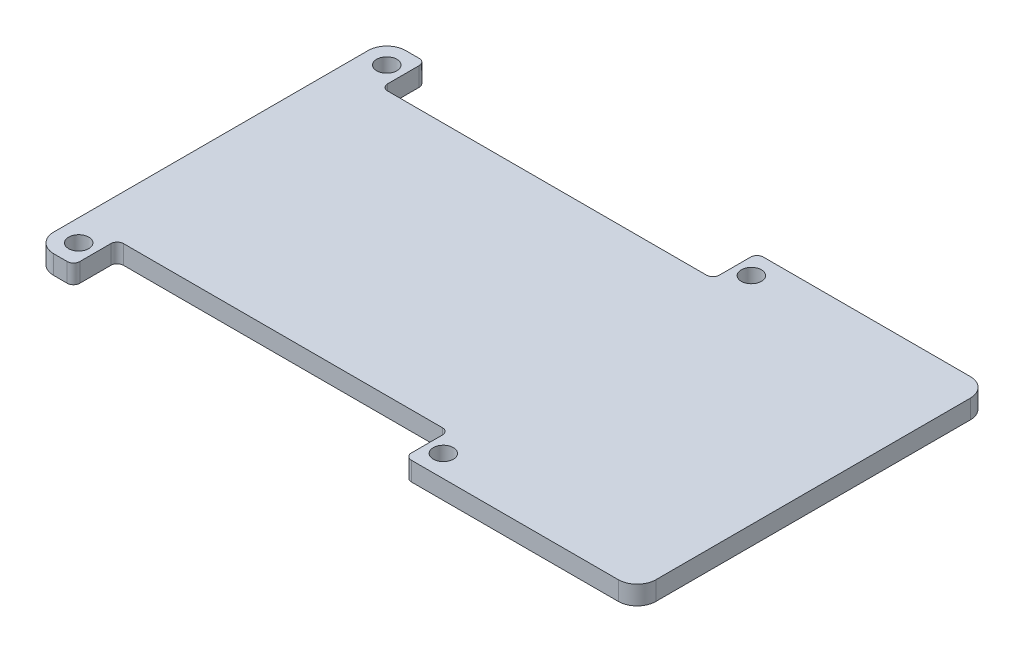
ISO-10303-21;
HEADER;
FILE_DESCRIPTION(('STEP AP214'),'2;1');
FILE_NAME('part.step','',(''),(''),'','','');
FILE_SCHEMA(('AUTOMOTIVE_DESIGN { 1 0 10303 214 1 1 1 1 }'));
ENDSEC;
DATA;
#1=APPLICATION_CONTEXT('core data for automotive mechanical design processes');
#2=APPLICATION_PROTOCOL_DEFINITION('international standard','automotive_design',2000,#1);
#3=PRODUCT_CONTEXT('',#1,'mechanical');
#4=PRODUCT('Part','Part','',(#3));
#5=PRODUCT_RELATED_PRODUCT_CATEGORY('part','',(#4));
#6=PRODUCT_DEFINITION_FORMATION('','',#4);
#7=PRODUCT_DEFINITION_CONTEXT('part definition',#1,'design');
#8=PRODUCT_DEFINITION('design','',#6,#7);
#9=PRODUCT_DEFINITION_SHAPE('','',#8);
#10=(LENGTH_UNIT() NAMED_UNIT(*) SI_UNIT(.MILLI.,.METRE.));
#11=(NAMED_UNIT(*) PLANE_ANGLE_UNIT() SI_UNIT($,.RADIAN.));
#12=(NAMED_UNIT(*) SI_UNIT($,.STERADIAN.) SOLID_ANGLE_UNIT());
#13=UNCERTAINTY_MEASURE_WITH_UNIT(LENGTH_MEASURE(1.E-05),#10,'distance_accuracy_value','');
#14=(GEOMETRIC_REPRESENTATION_CONTEXT(3) GLOBAL_UNCERTAINTY_ASSIGNED_CONTEXT((#13)) GLOBAL_UNIT_ASSIGNED_CONTEXT((#10,
#11,#12)) REPRESENTATION_CONTEXT('',''));
#15=CARTESIAN_POINT('',(0.,0.,0.));
#16=DIRECTION('',(0.,0.,1.));
#17=DIRECTION('',(1.,0.,0.));
#18=AXIS2_PLACEMENT_3D('',#15,#16,#17);
#19=CARTESIAN_POINT('',(-77.0217231267692,3.,-21.4026703774337));
#20=DIRECTION('',(0.,1.,0.));
#21=DIRECTION('',(0.,0.,1.));
#22=AXIS2_PLACEMENT_3D('',#19,#20,#21);
#23=PLANE('',#22);
#24=CARTESIAN_POINT('',(-18.5283322199872,3.,28.1136567752183));
#25=DIRECTION('',(0.,1.,0.));
#26=DIRECTION('',(0.,0.,1.));
#27=AXIS2_PLACEMENT_3D('',#24,#25,#26);
#28=CIRCLE('',#27,1.6);
#29=CARTESIAN_POINT('',(-18.5283322199872,3.,29.7136567752183));
#30=VERTEX_POINT('',#29);
#31=EDGE_CURVE('E453',#30,#30,#28,.T.);
#32=ORIENTED_EDGE('',*,*,#31,.F.);
#33=EDGE_LOOP('',(#32));
#34=FACE_BOUND('',#33,.T.);
#35=CARTESIAN_POINT('',(-76.5284846202892,3.,-20.8867242255417));
#36=DIRECTION('',(0.,1.,0.));
#37=DIRECTION('',(0.,0.,1.));
#38=AXIS2_PLACEMENT_3D('',#35,#36,#37);
#39=CIRCLE('',#38,1.6);
#40=CARTESIAN_POINT('',(-76.5284846202892,3.,-19.2867242255417));
#41=VERTEX_POINT('',#40);
#42=EDGE_CURVE('E236',#41,#41,#39,.T.);
#43=ORIENTED_EDGE('',*,*,#42,.F.);
#44=EDGE_LOOP('',(#43));
#45=FACE_BOUND('',#44,.T.);
#46=CARTESIAN_POINT('',(-77.0217231267692,3.,-21.4026703774337));
#47=DIRECTION('',(0.,1.,0.));
#48=DIRECTION('',(0.,0.,1.));
#49=AXIS2_PLACEMENT_3D('',#46,#47,#48);
#50=CIRCLE('',#49,2.98730505461);
#51=CARTESIAN_POINT('',(-77.0217231267692,3.,-24.3899754320437));
#52=VERTEX_POINT('',#51);
#53=CARTESIAN_POINT('',(-80.0090281813792,3.,-21.4026703774337));
#54=VERTEX_POINT('',#53);
#55=EDGE_CURVE('E279',#52,#54,#50,.T.);
#56=ORIENTED_EDGE('',*,*,#55,.T.);
#57=DIRECTION('',(0.,0.,1.));
#58=VECTOR('',#57,1.);
#59=CARTESIAN_POINT('',(-80.0090281813792,3.,-21.4026703774337));
#60=LINE('',#59,#58);
#61=CARTESIAN_POINT('',(-80.0090281813792,3.,28.6044314767683));
#62=VERTEX_POINT('',#61);
#63=EDGE_CURVE('E147',#54,#62,#60,.T.);
#64=ORIENTED_EDGE('',*,*,#63,.T.);
#65=CARTESIAN_POINT('',(-77.0217231267692,3.,28.6044314767683));
#66=DIRECTION('',(0.,1.,0.));
#67=DIRECTION('',(0.,0.,1.));
#68=AXIS2_PLACEMENT_3D('',#65,#66,#67);
#69=CIRCLE('',#68,2.98730505460999);
#70=CARTESIAN_POINT('',(-77.0217231267692,3.,31.5917365313783));
#71=VERTEX_POINT('',#70);
#72=EDGE_CURVE('E342',#62,#71,#69,.T.);
#73=ORIENTED_EDGE('',*,*,#72,.T.);
#74=DIRECTION('',(1.,0.,0.));
#75=VECTOR('',#74,1.);
#76=CARTESIAN_POINT('',(-77.0217231267692,3.,31.5917365313783));
#77=LINE('',#76,#75);
#78=CARTESIAN_POINT('',(-74.8747309147499,3.,31.5917365313783));
#79=VERTEX_POINT('',#78);
#80=EDGE_CURVE('E361',#71,#79,#77,.T.);
#81=ORIENTED_EDGE('',*,*,#80,.T.);
#82=CARTESIAN_POINT('',(-74.8747309147499,3.,30.5917365313783));
#83=DIRECTION('',(0.,1.,0.));
#84=DIRECTION('',(0.,0.,1.));
#85=AXIS2_PLACEMENT_3D('',#82,#83,#84);
#86=CIRCLE('',#85,1.);
#87=CARTESIAN_POINT('',(-73.8747309147499,3.,30.5917365313783));
#88=VERTEX_POINT('',#87);
#89=EDGE_CURVE('E358',#79,#88,#86,.T.);
#90=ORIENTED_EDGE('',*,*,#89,.T.);
#91=DIRECTION('',(0.,0.,-1.));
#92=VECTOR('',#91,1.);
#93=CARTESIAN_POINT('',(-73.8747309147499,3.,30.5917365313783));
#94=LINE('',#93,#92);
#95=CARTESIAN_POINT('',(-73.8747309147499,3.,25.6450286497662));
#96=VERTEX_POINT('',#95);
#97=EDGE_CURVE('E360',#88,#96,#94,.T.);
#98=ORIENTED_EDGE('',*,*,#97,.T.);
#99=CARTESIAN_POINT('',(-72.8747309147499,3.,25.6450286497662));
#100=DIRECTION('',(0.,-1.,0.));
#101=DIRECTION('',(0.,0.,-1.));
#102=AXIS2_PLACEMENT_3D('',#99,#100,#101);
#103=CIRCLE('',#102,1.);
#104=CARTESIAN_POINT('',(-72.8747309147499,3.,24.6450286497662));
#105=VERTEX_POINT('',#104);
#106=EDGE_CURVE('E363',#96,#105,#103,.T.);
#107=ORIENTED_EDGE('',*,*,#106,.T.);
#108=DIRECTION('',(1.,0.,0.));
#109=VECTOR('',#108,1.);
#110=CARTESIAN_POINT('',(-72.8747309147499,3.,24.6450286497662));
#111=LINE('',#110,#109);
#112=CARTESIAN_POINT('',(-22.1346281962434,3.,24.6450286497662));
#113=VERTEX_POINT('',#112);
#114=EDGE_CURVE('E369',#105,#113,#111,.T.);
#115=ORIENTED_EDGE('',*,*,#114,.T.);
#116=CARTESIAN_POINT('',(-22.1346281962434,3.,25.6450286497662));
#117=DIRECTION('',(0.,-1.,0.));
#118=DIRECTION('',(0.,0.,-1.));
#119=AXIS2_PLACEMENT_3D('',#116,#117,#118);
#120=CIRCLE('',#119,1.);
#121=CARTESIAN_POINT('',(-21.1346281962434,3.,25.6450286497662));
#122=VERTEX_POINT('',#121);
#123=EDGE_CURVE('E371',#113,#122,#120,.T.);
#124=ORIENTED_EDGE('',*,*,#123,.T.);
#125=DIRECTION('',(0.,0.,1.));
#126=VECTOR('',#125,1.);
#127=CARTESIAN_POINT('',(-21.1346281962434,3.,25.6450286497662));
#128=LINE('',#127,#126);
#129=CARTESIAN_POINT('',(-21.1346281962434,3.,30.5917365313783));
#130=VERTEX_POINT('',#129);
#131=EDGE_CURVE('E373',#122,#130,#128,.T.);
#132=ORIENTED_EDGE('',*,*,#131,.T.);
#133=CARTESIAN_POINT('',(-20.1346281962434,3.,30.5917365313783));
#134=DIRECTION('',(0.,1.,0.));
#135=DIRECTION('',(0.,0.,1.));
#136=AXIS2_PLACEMENT_3D('',#133,#134,#135);
#137=CIRCLE('',#136,1.);
#138=CARTESIAN_POINT('',(-20.1346281962434,3.,31.5917365313783));
#139=VERTEX_POINT('',#138);
#140=EDGE_CURVE('E375',#130,#139,#137,.T.);
#141=ORIENTED_EDGE('',*,*,#140,.T.);
#142=DIRECTION('',(1.,0.,0.));
#143=VECTOR('',#142,1.);
#144=CARTESIAN_POINT('',(-20.1346281962434,3.,31.5917365313783));
#145=LINE('',#144,#143);
#146=CARTESIAN_POINT('',(12.7872583311938,3.,31.5917365313783));
#147=VERTEX_POINT('',#146);
#148=EDGE_CURVE('E377',#139,#147,#145,.T.);
#149=ORIENTED_EDGE('',*,*,#148,.T.);
#150=CARTESIAN_POINT('',(12.7872583311938,3.,28.6044314767683));
#151=DIRECTION('',(0.,1.,0.));
#152=DIRECTION('',(0.,0.,1.));
#153=AXIS2_PLACEMENT_3D('',#150,#151,#152);
#154=CIRCLE('',#153,2.98730505461);
#155=CARTESIAN_POINT('',(15.7745633858038,3.,28.6044314767683));
#156=VERTEX_POINT('',#155);
#157=EDGE_CURVE('E379',#147,#156,#154,.T.);
#158=ORIENTED_EDGE('',*,*,#157,.T.);
#159=DIRECTION('',(0.,0.,-1.));
#160=VECTOR('',#159,1.);
#161=CARTESIAN_POINT('',(15.7745633858038,3.,28.6044314767683));
#162=LINE('',#161,#160);
#163=CARTESIAN_POINT('',(15.7745633858038,3.,-21.4026703774337));
#164=VERTEX_POINT('',#163);
#165=EDGE_CURVE('E381',#156,#164,#162,.T.);
#166=ORIENTED_EDGE('',*,*,#165,.T.);
#167=CARTESIAN_POINT('',(12.7872583311938,3.,-21.4026703774337));
#168=DIRECTION('',(0.,1.,0.));
#169=DIRECTION('',(0.,0.,1.));
#170=AXIS2_PLACEMENT_3D('',#167,#168,#169);
#171=CIRCLE('',#170,2.98730505461001);
#172=CARTESIAN_POINT('',(12.7872583311938,3.,-24.3899754320437));
#173=VERTEX_POINT('',#172);
#174=EDGE_CURVE('E383',#164,#173,#171,.T.);
#175=ORIENTED_EDGE('',*,*,#174,.T.);
#176=DIRECTION('',(-1.,0.,0.));
#177=VECTOR('',#176,1.);
#178=CARTESIAN_POINT('',(12.7872583311938,3.,-24.3899754320437));
#179=LINE('',#178,#177);
#180=CARTESIAN_POINT('',(-20.1346281962434,3.,-24.3899754320437));
#181=VERTEX_POINT('',#180);
#182=EDGE_CURVE('E385',#173,#181,#179,.T.);
#183=ORIENTED_EDGE('',*,*,#182,.T.);
#184=CARTESIAN_POINT('',(-20.1346281962434,3.,-23.3899754320437));
#185=DIRECTION('',(0.,1.,0.));
#186=DIRECTION('',(0.,0.,-1.));
#187=AXIS2_PLACEMENT_3D('',#184,#185,#186);
#188=CIRCLE('',#187,1.);
#189=CARTESIAN_POINT('',(-21.1346281962434,3.,-23.3899754320437));
#190=VERTEX_POINT('',#189);
#191=EDGE_CURVE('E387',#181,#190,#188,.T.);
#192=ORIENTED_EDGE('',*,*,#191,.T.);
#193=DIRECTION('',(0.,0.,1.));
#194=VECTOR('',#193,1.);
#195=CARTESIAN_POINT('',(-21.1346281962434,3.,-23.3899754320437));
#196=LINE('',#195,#194);
#197=CARTESIAN_POINT('',(-21.1346281962434,3.,-18.3777360046756));
#198=VERTEX_POINT('',#197);
#199=EDGE_CURVE('E389',#190,#198,#196,.T.);
#200=ORIENTED_EDGE('',*,*,#199,.T.);
#201=CARTESIAN_POINT('',(-22.1346281962434,3.,-18.3777360046756));
#202=DIRECTION('',(0.,-1.,0.));
#203=DIRECTION('',(0.,0.,1.));
#204=AXIS2_PLACEMENT_3D('',#201,#202,#203);
#205=CIRCLE('',#204,1.);
#206=CARTESIAN_POINT('',(-22.1346281962434,3.,-17.3777360046756));
#207=VERTEX_POINT('',#206);
#208=EDGE_CURVE('E391',#198,#207,#205,.T.);
#209=ORIENTED_EDGE('',*,*,#208,.T.);
#210=DIRECTION('',(-1.,0.,0.));
#211=VECTOR('',#210,1.);
#212=CARTESIAN_POINT('',(-22.1346281962434,3.,-17.3777360046756));
#213=LINE('',#212,#211);
#214=CARTESIAN_POINT('',(-72.8747309147499,3.,-17.3777360046756));
#215=VERTEX_POINT('',#214);
#216=EDGE_CURVE('E393',#207,#215,#213,.T.);
#217=ORIENTED_EDGE('',*,*,#216,.T.);
#218=CARTESIAN_POINT('',(-72.8747309147499,3.,-18.3777360046756));
#219=DIRECTION('',(0.,-1.,0.));
#220=DIRECTION('',(0.,0.,1.));
#221=AXIS2_PLACEMENT_3D('',#218,#219,#220);
#222=CIRCLE('',#221,1.);
#223=CARTESIAN_POINT('',(-73.8747309147499,3.,-18.3777360046756));
#224=VERTEX_POINT('',#223);
#225=EDGE_CURVE('E214',#215,#224,#222,.T.);
#226=ORIENTED_EDGE('',*,*,#225,.T.);
#227=DIRECTION('',(0.,0.,-1.));
#228=VECTOR('',#227,1.);
#229=CARTESIAN_POINT('',(-73.8747309147499,3.,-18.3777360046756));
#230=LINE('',#229,#228);
#231=CARTESIAN_POINT('',(-73.8747309147499,3.,-23.3899754320437));
#232=VERTEX_POINT('',#231);
#233=EDGE_CURVE('E208',#224,#232,#230,.T.);
#234=ORIENTED_EDGE('',*,*,#233,.T.);
#235=CARTESIAN_POINT('',(-74.8747309147499,3.,-23.3899754320437));
#236=DIRECTION('',(0.,1.,0.));
#237=DIRECTION('',(0.,0.,-1.));
#238=AXIS2_PLACEMENT_3D('',#235,#236,#237);
#239=CIRCLE('',#238,1.);
#240=CARTESIAN_POINT('',(-74.8747309147499,3.,-24.3899754320437));
#241=VERTEX_POINT('',#240);
#242=EDGE_CURVE('E212',#232,#241,#239,.T.);
#243=ORIENTED_EDGE('',*,*,#242,.T.);
#244=DIRECTION('',(-1.,0.,0.));
#245=VECTOR('',#244,1.);
#246=CARTESIAN_POINT('',(-74.8747309147499,3.,-24.3899754320437));
#247=LINE('',#246,#245);
#248=EDGE_CURVE('E56',#241,#52,#247,.T.);
#249=ORIENTED_EDGE('',*,*,#248,.T.);
#250=EDGE_LOOP('',(#56,#64,#73,#81,#90,#98,#107,#115,#124,#132,#141,#149,#158,#166,#175,#183,
#192,#200,#209,#217,#226,#234,#243,#249));
#251=FACE_BOUND('',#250,.T.);
#252=CARTESIAN_POINT('',(-18.5285862204952,3.,-20.8865972252877));
#253=DIRECTION('',(0.,1.,0.));
#254=DIRECTION('',(0.,0.,1.));
#255=AXIS2_PLACEMENT_3D('',#252,#253,#254);
#256=CIRCLE('',#255,1.6);
#257=CARTESIAN_POINT('',(-18.5285862204952,3.,-19.2865972252877));
#258=VERTEX_POINT('',#257);
#259=EDGE_CURVE('E459',#258,#258,#256,.T.);
#260=ORIENTED_EDGE('',*,*,#259,.F.);
#261=EDGE_LOOP('',(#260));
#262=FACE_BOUND('',#261,.T.);
#263=CARTESIAN_POINT('',(-76.5283322199792,3.,28.1135297749583));
#264=DIRECTION('',(0.,1.,0.));
#265=DIRECTION('',(0.,0.,1.));
#266=AXIS2_PLACEMENT_3D('',#263,#264,#265);
#267=CIRCLE('',#266,1.6);
#268=CARTESIAN_POINT('',(-76.5283322199792,3.,29.7135297749583));
#269=VERTEX_POINT('',#268);
#270=EDGE_CURVE('E444',#269,#269,#267,.T.);
#271=ORIENTED_EDGE('',*,*,#270,.F.);
#272=EDGE_LOOP('',(#271));
#273=FACE_BOUND('',#272,.T.);
#274=ADVANCED_FACE('F39',(#34,#45,#251,#262,#273),#23,.T.);
#275=CARTESIAN_POINT('',(-77.0217231267692,0.,-21.4026703774337));
#276=DIRECTION('',(0.,1.,0.));
#277=DIRECTION('',(0.,0.,1.));
#278=AXIS2_PLACEMENT_3D('',#275,#276,#277);
#279=PLANE('',#278);
#280=CARTESIAN_POINT('',(-77.0217231267692,0.,-21.4026703774337));
#281=DIRECTION('',(0.,1.,0.));
#282=DIRECTION('',(0.,0.,1.));
#283=AXIS2_PLACEMENT_3D('',#280,#281,#282);
#284=CIRCLE('',#283,2.98730505461);
#285=CARTESIAN_POINT('',(-77.0217231267692,0.,-24.3899754320437));
#286=VERTEX_POINT('',#285);
#287=CARTESIAN_POINT('',(-80.0090281813792,0.,-21.4026703774337));
#288=VERTEX_POINT('',#287);
#289=EDGE_CURVE('E232',#286,#288,#284,.T.);
#290=ORIENTED_EDGE('',*,*,#289,.F.);
#291=DIRECTION('',(-1.,0.,0.));
#292=VECTOR('',#291,1.);
#293=CARTESIAN_POINT('',(-74.8747309147499,0.,-24.3899754320437));
#294=LINE('',#293,#292);
#295=CARTESIAN_POINT('',(-74.8747309147499,0.,-24.3899754320437));
#296=VERTEX_POINT('',#295);
#297=EDGE_CURVE('E139',#296,#286,#294,.T.);
#298=ORIENTED_EDGE('',*,*,#297,.F.);
#299=CARTESIAN_POINT('',(-74.8747309147499,0.,-23.3899754320437));
#300=DIRECTION('',(0.,1.,0.));
#301=DIRECTION('',(0.,0.,-1.));
#302=AXIS2_PLACEMENT_3D('',#299,#300,#301);
#303=CIRCLE('',#302,1.);
#304=CARTESIAN_POINT('',(-73.8747309147499,0.,-23.3899754320437));
#305=VERTEX_POINT('',#304);
#306=EDGE_CURVE('E133',#305,#296,#303,.T.);
#307=ORIENTED_EDGE('',*,*,#306,.F.);
#308=DIRECTION('',(0.,0.,-1.));
#309=VECTOR('',#308,1.);
#310=CARTESIAN_POINT('',(-73.8747309147499,0.,-18.3777360046756));
#311=LINE('',#310,#309);
#312=CARTESIAN_POINT('',(-73.8747309147499,0.,-18.3777360046756));
#313=VERTEX_POINT('',#312);
#314=EDGE_CURVE('E222',#313,#305,#311,.T.);
#315=ORIENTED_EDGE('',*,*,#314,.F.);
#316=CARTESIAN_POINT('',(-72.8747309147499,0.,-18.3777360046756));
#317=DIRECTION('',(0.,-1.,0.));
#318=DIRECTION('',(0.,0.,1.));
#319=AXIS2_PLACEMENT_3D('',#316,#317,#318);
#320=CIRCLE('',#319,1.);
#321=CARTESIAN_POINT('',(-72.8747309147499,0.,-17.3777360046756));
#322=VERTEX_POINT('',#321);
#323=EDGE_CURVE('E274',#322,#313,#320,.T.);
#324=ORIENTED_EDGE('',*,*,#323,.F.);
#325=DIRECTION('',(-1.,0.,0.));
#326=VECTOR('',#325,1.);
#327=CARTESIAN_POINT('',(-22.1346281962434,0.,-17.3777360046756));
#328=LINE('',#327,#326);
#329=CARTESIAN_POINT('',(-22.1346281962434,0.,-17.3777360046756));
#330=VERTEX_POINT('',#329);
#331=EDGE_CURVE('E272',#330,#322,#328,.T.);
#332=ORIENTED_EDGE('',*,*,#331,.F.);
#333=CARTESIAN_POINT('',(-22.1346281962434,0.,-18.3777360046756));
#334=DIRECTION('',(0.,-1.,0.));
#335=DIRECTION('',(0.,0.,1.));
#336=AXIS2_PLACEMENT_3D('',#333,#334,#335);
#337=CIRCLE('',#336,1.);
#338=CARTESIAN_POINT('',(-21.1346281962434,0.,-18.3777360046756));
#339=VERTEX_POINT('',#338);
#340=EDGE_CURVE('E270',#339,#330,#337,.T.);
#341=ORIENTED_EDGE('',*,*,#340,.F.);
#342=DIRECTION('',(0.,0.,1.));
#343=VECTOR('',#342,1.);
#344=CARTESIAN_POINT('',(-21.1346281962434,0.,-23.3899754320437));
#345=LINE('',#344,#343);
#346=CARTESIAN_POINT('',(-21.1346281962434,0.,-23.3899754320437));
#347=VERTEX_POINT('',#346);
#348=EDGE_CURVE('E268',#347,#339,#345,.T.);
#349=ORIENTED_EDGE('',*,*,#348,.F.);
#350=CARTESIAN_POINT('',(-20.1346281962434,0.,-23.3899754320437));
#351=DIRECTION('',(0.,1.,0.));
#352=DIRECTION('',(0.,0.,-1.));
#353=AXIS2_PLACEMENT_3D('',#350,#351,#352);
#354=CIRCLE('',#353,1.);
#355=CARTESIAN_POINT('',(-20.1346281962434,0.,-24.3899754320437));
#356=VERTEX_POINT('',#355);
#357=EDGE_CURVE('E266',#356,#347,#354,.T.);
#358=ORIENTED_EDGE('',*,*,#357,.F.);
#359=DIRECTION('',(-1.,0.,0.));
#360=VECTOR('',#359,1.);
#361=CARTESIAN_POINT('',(12.7872583311938,0.,-24.3899754320437));
#362=LINE('',#361,#360);
#363=CARTESIAN_POINT('',(12.7872583311938,0.,-24.3899754320437));
#364=VERTEX_POINT('',#363);
#365=EDGE_CURVE('E264',#364,#356,#362,.T.);
#366=ORIENTED_EDGE('',*,*,#365,.F.);
#367=CARTESIAN_POINT('',(12.7872583311938,0.,-21.4026703774337));
#368=DIRECTION('',(0.,1.,0.));
#369=DIRECTION('',(0.,0.,1.));
#370=AXIS2_PLACEMENT_3D('',#367,#368,#369);
#371=CIRCLE('',#370,2.98730505461001);
#372=CARTESIAN_POINT('',(15.7745633858038,0.,-21.4026703774337));
#373=VERTEX_POINT('',#372);
#374=EDGE_CURVE('E262',#373,#364,#371,.T.);
#375=ORIENTED_EDGE('',*,*,#374,.F.);
#376=DIRECTION('',(0.,0.,-1.));
#377=VECTOR('',#376,1.);
#378=CARTESIAN_POINT('',(15.7745633858038,0.,28.6044314767683));
#379=LINE('',#378,#377);
#380=CARTESIAN_POINT('',(15.7745633858038,0.,28.6044314767683));
#381=VERTEX_POINT('',#380);
#382=EDGE_CURVE('E260',#381,#373,#379,.T.);
#383=ORIENTED_EDGE('',*,*,#382,.F.);
#384=CARTESIAN_POINT('',(12.7872583311938,0.,28.6044314767683));
#385=DIRECTION('',(0.,1.,0.));
#386=DIRECTION('',(0.,0.,1.));
#387=AXIS2_PLACEMENT_3D('',#384,#385,#386);
#388=CIRCLE('',#387,2.98730505461);
#389=CARTESIAN_POINT('',(12.7872583311938,0.,31.5917365313783));
#390=VERTEX_POINT('',#389);
#391=EDGE_CURVE('E258',#390,#381,#388,.T.);
#392=ORIENTED_EDGE('',*,*,#391,.F.);
#393=DIRECTION('',(1.,0.,0.));
#394=VECTOR('',#393,1.);
#395=CARTESIAN_POINT('',(-20.1346281962434,0.,31.5917365313783));
#396=LINE('',#395,#394);
#397=CARTESIAN_POINT('',(-20.1346281962434,0.,31.5917365313783));
#398=VERTEX_POINT('',#397);
#399=EDGE_CURVE('E256',#398,#390,#396,.T.);
#400=ORIENTED_EDGE('',*,*,#399,.F.);
#401=CARTESIAN_POINT('',(-20.1346281962434,0.,30.5917365313783));
#402=DIRECTION('',(0.,1.,0.));
#403=DIRECTION('',(0.,0.,1.));
#404=AXIS2_PLACEMENT_3D('',#401,#402,#403);
#405=CIRCLE('',#404,1.);
#406=CARTESIAN_POINT('',(-21.1346281962434,0.,30.5917365313783));
#407=VERTEX_POINT('',#406);
#408=EDGE_CURVE('E254',#407,#398,#405,.T.);
#409=ORIENTED_EDGE('',*,*,#408,.F.);
#410=DIRECTION('',(0.,0.,1.));
#411=VECTOR('',#410,1.);
#412=CARTESIAN_POINT('',(-21.1346281962434,0.,25.6450286497662));
#413=LINE('',#412,#411);
#414=CARTESIAN_POINT('',(-21.1346281962434,0.,25.6450286497662));
#415=VERTEX_POINT('',#414);
#416=EDGE_CURVE('E252',#415,#407,#413,.T.);
#417=ORIENTED_EDGE('',*,*,#416,.F.);
#418=CARTESIAN_POINT('',(-22.1346281962434,0.,25.6450286497662));
#419=DIRECTION('',(0.,-1.,0.));
#420=DIRECTION('',(0.,0.,-1.));
#421=AXIS2_PLACEMENT_3D('',#418,#419,#420);
#422=CIRCLE('',#421,1.);
#423=CARTESIAN_POINT('',(-22.1346281962434,0.,24.6450286497662));
#424=VERTEX_POINT('',#423);
#425=EDGE_CURVE('E250',#424,#415,#422,.T.);
#426=ORIENTED_EDGE('',*,*,#425,.F.);
#427=DIRECTION('',(1.,0.,0.));
#428=VECTOR('',#427,1.);
#429=CARTESIAN_POINT('',(-72.8747309147499,0.,24.6450286497662));
#430=LINE('',#429,#428);
#431=CARTESIAN_POINT('',(-72.8747309147499,0.,24.6450286497662));
#432=VERTEX_POINT('',#431);
#433=EDGE_CURVE('E248',#432,#424,#430,.T.);
#434=ORIENTED_EDGE('',*,*,#433,.F.);
#435=CARTESIAN_POINT('',(-72.8747309147499,0.,25.6450286497662));
#436=DIRECTION('',(0.,-1.,0.));
#437=DIRECTION('',(0.,0.,-1.));
#438=AXIS2_PLACEMENT_3D('',#435,#436,#437);
#439=CIRCLE('',#438,1.);
#440=CARTESIAN_POINT('',(-73.8747309147499,0.,25.6450286497662));
#441=VERTEX_POINT('',#440);
#442=EDGE_CURVE('E246',#441,#432,#439,.T.);
#443=ORIENTED_EDGE('',*,*,#442,.F.);
#444=DIRECTION('',(0.,0.,-1.));
#445=VECTOR('',#444,1.);
#446=CARTESIAN_POINT('',(-73.8747309147499,0.,30.5917365313783));
#447=LINE('',#446,#445);
#448=CARTESIAN_POINT('',(-73.8747309147499,0.,30.5917365313783));
#449=VERTEX_POINT('',#448);
#450=EDGE_CURVE('E244',#449,#441,#447,.T.);
#451=ORIENTED_EDGE('',*,*,#450,.F.);
#452=CARTESIAN_POINT('',(-74.8747309147499,0.,30.5917365313783));
#453=DIRECTION('',(0.,1.,0.));
#454=DIRECTION('',(0.,0.,1.));
#455=AXIS2_PLACEMENT_3D('',#452,#453,#454);
#456=CIRCLE('',#455,1.);
#457=CARTESIAN_POINT('',(-74.8747309147499,0.,31.5917365313783));
#458=VERTEX_POINT('',#457);
#459=EDGE_CURVE('E242',#458,#449,#456,.T.);
#460=ORIENTED_EDGE('',*,*,#459,.F.);
#461=DIRECTION('',(1.,0.,0.));
#462=VECTOR('',#461,1.);
#463=CARTESIAN_POINT('',(-77.0217231267692,0.,31.5917365313783));
#464=LINE('',#463,#462);
#465=CARTESIAN_POINT('',(-77.0217231267692,0.,31.5917365313783));
#466=VERTEX_POINT('',#465);
#467=EDGE_CURVE('E240',#466,#458,#464,.T.);
#468=ORIENTED_EDGE('',*,*,#467,.F.);
#469=CARTESIAN_POINT('',(-77.0217231267692,0.,28.6044314767683));
#470=DIRECTION('',(0.,1.,0.));
#471=DIRECTION('',(0.,0.,1.));
#472=AXIS2_PLACEMENT_3D('',#469,#470,#471);
#473=CIRCLE('',#472,2.98730505460999);
#474=CARTESIAN_POINT('',(-80.0090281813792,0.,28.6044314767683));
#475=VERTEX_POINT('',#474);
#476=EDGE_CURVE('E238',#475,#466,#473,.T.);
#477=ORIENTED_EDGE('',*,*,#476,.F.);
#478=DIRECTION('',(0.,0.,1.));
#479=VECTOR('',#478,1.);
#480=CARTESIAN_POINT('',(-80.0090281813792,0.,-21.4026703774337));
#481=LINE('',#480,#479);
#482=EDGE_CURVE('E235',#288,#475,#481,.T.);
#483=ORIENTED_EDGE('',*,*,#482,.F.);
#484=EDGE_LOOP('',(#290,#298,#307,#315,#324,#332,#341,#349,#358,#366,#375,#383,#392,#400,#409,
#417,#426,#434,#443,#451,#460,#468,#477,#483));
#485=FACE_BOUND('',#484,.T.);
#486=CARTESIAN_POINT('',(-76.5284846202892,0.,-20.8867242255417));
#487=DIRECTION('',(0.,1.,0.));
#488=DIRECTION('',(0.,0.,1.));
#489=AXIS2_PLACEMENT_3D('',#486,#487,#488);
#490=CIRCLE('',#489,1.6);
#491=CARTESIAN_POINT('',(-76.5284846202892,0.,-19.2867242255417));
#492=VERTEX_POINT('',#491);
#493=EDGE_CURVE('E462',#492,#492,#490,.T.);
#494=ORIENTED_EDGE('',*,*,#493,.T.);
#495=EDGE_LOOP('',(#494));
#496=FACE_BOUND('',#495,.T.);
#497=CARTESIAN_POINT('',(-18.5285862204952,0.,-20.8865972252877));
#498=DIRECTION('',(0.,1.,0.));
#499=DIRECTION('',(0.,0.,1.));
#500=AXIS2_PLACEMENT_3D('',#497,#498,#499);
#501=CIRCLE('',#500,1.6);
#502=CARTESIAN_POINT('',(-18.5285862204952,0.,-19.2865972252877));
#503=VERTEX_POINT('',#502);
#504=EDGE_CURVE('E456',#503,#503,#501,.T.);
#505=ORIENTED_EDGE('',*,*,#504,.T.);
#506=EDGE_LOOP('',(#505));
#507=FACE_BOUND('',#506,.T.);
#508=CARTESIAN_POINT('',(-18.5283322199872,0.,28.1136567752183));
#509=DIRECTION('',(0.,1.,0.));
#510=DIRECTION('',(0.,0.,1.));
#511=AXIS2_PLACEMENT_3D('',#508,#509,#510);
#512=CIRCLE('',#511,1.6);
#513=CARTESIAN_POINT('',(-18.5283322199872,0.,29.7136567752183));
#514=VERTEX_POINT('',#513);
#515=EDGE_CURVE('E450',#514,#514,#512,.T.);
#516=ORIENTED_EDGE('',*,*,#515,.T.);
#517=EDGE_LOOP('',(#516));
#518=FACE_BOUND('',#517,.T.);
#519=CARTESIAN_POINT('',(-76.5283322199792,0.,28.1135297749583));
#520=DIRECTION('',(0.,1.,0.));
#521=DIRECTION('',(0.,0.,1.));
#522=AXIS2_PLACEMENT_3D('',#519,#520,#521);
#523=CIRCLE('',#522,1.6);
#524=CARTESIAN_POINT('',(-76.5283322199792,0.,29.7135297749583));
#525=VERTEX_POINT('',#524);
#526=EDGE_CURVE('E447',#525,#525,#523,.T.);
#527=ORIENTED_EDGE('',*,*,#526,.T.);
#528=EDGE_LOOP('',(#527));
#529=FACE_BOUND('',#528,.T.);
#530=ADVANCED_FACE('F346',(#485,#496,#507,#518,#529),#279,.F.);
#531=CARTESIAN_POINT('',(-77.0217231267692,3.,-21.4026703774337));
#532=DIRECTION('',(0.,-1.,0.));
#533=DIRECTION('',(0.,0.,-1.));
#534=AXIS2_PLACEMENT_3D('',#531,#532,#533);
#535=CYLINDRICAL_SURFACE('',#534,2.98730505461);
#536=ORIENTED_EDGE('',*,*,#289,.T.);
#537=DIRECTION('',(0.,-1.,0.));
#538=VECTOR('',#537,1.);
#539=CARTESIAN_POINT('',(-80.0090281813792,3.,-21.4026703774337));
#540=LINE('',#539,#538);
#541=EDGE_CURVE('E11',#54,#288,#540,.T.);
#542=ORIENTED_EDGE('',*,*,#541,.F.);
#543=ORIENTED_EDGE('',*,*,#55,.F.);
#544=DIRECTION('',(0.,-1.,0.));
#545=VECTOR('',#544,1.);
#546=CARTESIAN_POINT('',(-77.0217231267692,3.,-24.3899754320437));
#547=LINE('',#546,#545);
#548=EDGE_CURVE('E228',#52,#286,#547,.T.);
#549=ORIENTED_EDGE('',*,*,#548,.T.);
#550=EDGE_LOOP('',(#536,#542,#543,#549));
#551=FACE_BOUND('',#550,.T.);
#552=ADVANCED_FACE('F41',(#551),#535,.T.);
#553=CARTESIAN_POINT('',(-80.0090281813792,3.,-21.4026703774337));
#554=DIRECTION('',(1.,0.,0.));
#555=DIRECTION('',(0.,0.,-1.));
#556=AXIS2_PLACEMENT_3D('',#553,#554,#555);
#557=PLANE('',#556);
#558=ORIENTED_EDGE('',*,*,#482,.T.);
#559=DIRECTION('',(0.,-1.,0.));
#560=VECTOR('',#559,1.);
#561=CARTESIAN_POINT('',(-80.0090281813792,3.,28.6044314767683));
#562=LINE('',#561,#560);
#563=EDGE_CURVE('E48',#62,#475,#562,.T.);
#564=ORIENTED_EDGE('',*,*,#563,.F.);
#565=ORIENTED_EDGE('',*,*,#63,.F.);
#566=ORIENTED_EDGE('',*,*,#541,.T.);
#567=EDGE_LOOP('',(#558,#564,#565,#566));
#568=FACE_BOUND('',#567,.T.);
#569=ADVANCED_FACE('F714',(#568),#557,.F.);
#570=CARTESIAN_POINT('',(-77.0217231267692,3.,28.6044314767683));
#571=DIRECTION('',(0.,-1.,0.));
#572=DIRECTION('',(0.,0.,-1.));
#573=AXIS2_PLACEMENT_3D('',#570,#571,#572);
#574=CYLINDRICAL_SURFACE('',#573,2.98730505460999);
#575=ORIENTED_EDGE('',*,*,#476,.T.);
#576=DIRECTION('',(0.,-1.,0.));
#577=VECTOR('',#576,1.);
#578=CARTESIAN_POINT('',(-77.0217231267692,3.,31.5917365313783));
#579=LINE('',#578,#577);
#580=EDGE_CURVE('E334',#71,#466,#579,.T.);
#581=ORIENTED_EDGE('',*,*,#580,.F.);
#582=ORIENTED_EDGE('',*,*,#72,.F.);
#583=ORIENTED_EDGE('',*,*,#563,.T.);
#584=EDGE_LOOP('',(#575,#581,#582,#583));
#585=FACE_BOUND('',#584,.T.);
#586=ADVANCED_FACE('F340',(#585),#574,.T.);
#587=CARTESIAN_POINT('',(-77.0217231267692,3.,31.5917365313783));
#588=DIRECTION('',(0.,0.,-1.));
#589=DIRECTION('',(-1.,0.,0.));
#590=AXIS2_PLACEMENT_3D('',#587,#588,#589);
#591=PLANE('',#590);
#592=ORIENTED_EDGE('',*,*,#467,.T.);
#593=DIRECTION('',(0.,-1.,0.));
#594=VECTOR('',#593,1.);
#595=CARTESIAN_POINT('',(-74.8747309147499,3.,31.5917365313783));
#596=LINE('',#595,#594);
#597=EDGE_CURVE('E331',#79,#458,#596,.T.);
#598=ORIENTED_EDGE('',*,*,#597,.F.);
#599=ORIENTED_EDGE('',*,*,#80,.F.);
#600=ORIENTED_EDGE('',*,*,#580,.T.);
#601=EDGE_LOOP('',(#592,#598,#599,#600));
#602=FACE_BOUND('',#601,.T.);
#603=ADVANCED_FACE('F352',(#602),#591,.F.);
#604=CARTESIAN_POINT('',(-74.8747309147499,3.,30.5917365313783));
#605=DIRECTION('',(0.,-1.,0.));
#606=DIRECTION('',(0.,0.,-1.));
#607=AXIS2_PLACEMENT_3D('',#604,#605,#606);
#608=CYLINDRICAL_SURFACE('',#607,1.);
#609=ORIENTED_EDGE('',*,*,#459,.T.);
#610=DIRECTION('',(0.,-1.,0.));
#611=VECTOR('',#610,1.);
#612=CARTESIAN_POINT('',(-73.8747309147499,3.,30.5917365313783));
#613=LINE('',#612,#611);
#614=EDGE_CURVE('E328',#88,#449,#613,.T.);
#615=ORIENTED_EDGE('',*,*,#614,.F.);
#616=ORIENTED_EDGE('',*,*,#89,.F.);
#617=ORIENTED_EDGE('',*,*,#597,.T.);
#618=EDGE_LOOP('',(#609,#615,#616,#617));
#619=FACE_BOUND('',#618,.T.);
#620=ADVANCED_FACE('F356',(#619),#608,.T.);
#621=CARTESIAN_POINT('',(-73.8747309147499,3.,30.5917365313783));
#622=DIRECTION('',(-1.,0.,0.));
#623=DIRECTION('',(0.,0.,1.));
#624=AXIS2_PLACEMENT_3D('',#621,#622,#623);
#625=PLANE('',#624);
#626=ORIENTED_EDGE('',*,*,#450,.T.);
#627=DIRECTION('',(0.,-1.,0.));
#628=VECTOR('',#627,1.);
#629=CARTESIAN_POINT('',(-73.8747309147499,3.,25.6450286497662));
#630=LINE('',#629,#628);
#631=EDGE_CURVE('E325',#96,#441,#630,.T.);
#632=ORIENTED_EDGE('',*,*,#631,.F.);
#633=ORIENTED_EDGE('',*,*,#97,.F.);
#634=ORIENTED_EDGE('',*,*,#614,.T.);
#635=EDGE_LOOP('',(#626,#632,#633,#634));
#636=FACE_BOUND('',#635,.T.);
#637=ADVANCED_FACE('F675',(#636),#625,.F.);
#638=CARTESIAN_POINT('',(-72.8747309147499,3.,25.6450286497662));
#639=DIRECTION('',(0.,-1.,0.));
#640=DIRECTION('',(0.,0.,-1.));
#641=AXIS2_PLACEMENT_3D('',#638,#639,#640);
#642=CYLINDRICAL_SURFACE('',#641,1.);
#643=ORIENTED_EDGE('',*,*,#442,.T.);
#644=DIRECTION('',(0.,-1.,0.));
#645=VECTOR('',#644,1.);
#646=CARTESIAN_POINT('',(-72.8747309147499,3.,24.6450286497662));
#647=LINE('',#646,#645);
#648=EDGE_CURVE('E322',#105,#432,#647,.T.);
#649=ORIENTED_EDGE('',*,*,#648,.F.);
#650=ORIENTED_EDGE('',*,*,#106,.F.);
#651=ORIENTED_EDGE('',*,*,#631,.T.);
#652=EDGE_LOOP('',(#643,#649,#650,#651));
#653=FACE_BOUND('',#652,.T.);
#654=ADVANCED_FACE('F664',(#653),#642,.F.);
#655=CARTESIAN_POINT('',(-72.8747309147499,3.,24.6450286497662));
#656=DIRECTION('',(0.,0.,-1.));
#657=DIRECTION('',(-1.,0.,0.));
#658=AXIS2_PLACEMENT_3D('',#655,#656,#657);
#659=PLANE('',#658);
#660=ORIENTED_EDGE('',*,*,#433,.T.);
#661=DIRECTION('',(0.,-1.,0.));
#662=VECTOR('',#661,1.);
#663=CARTESIAN_POINT('',(-22.1346281962434,3.,24.6450286497662));
#664=LINE('',#663,#662);
#665=EDGE_CURVE('E319',#113,#424,#664,.T.);
#666=ORIENTED_EDGE('',*,*,#665,.F.);
#667=ORIENTED_EDGE('',*,*,#114,.F.);
#668=ORIENTED_EDGE('',*,*,#648,.T.);
#669=EDGE_LOOP('',(#660,#666,#667,#668));
#670=FACE_BOUND('',#669,.T.);
#671=ADVANCED_FACE('F653',(#670),#659,.F.);
#672=CARTESIAN_POINT('',(-22.1346281962434,3.,25.6450286497662));
#673=DIRECTION('',(0.,-1.,0.));
#674=DIRECTION('',(0.,0.,-1.));
#675=AXIS2_PLACEMENT_3D('',#672,#673,#674);
#676=CYLINDRICAL_SURFACE('',#675,1.);
#677=ORIENTED_EDGE('',*,*,#425,.T.);
#678=DIRECTION('',(0.,-1.,0.));
#679=VECTOR('',#678,1.);
#680=CARTESIAN_POINT('',(-21.1346281962434,3.,25.6450286497662));
#681=LINE('',#680,#679);
#682=EDGE_CURVE('E316',#122,#415,#681,.T.);
#683=ORIENTED_EDGE('',*,*,#682,.F.);
#684=ORIENTED_EDGE('',*,*,#123,.F.);
#685=ORIENTED_EDGE('',*,*,#665,.T.);
#686=EDGE_LOOP('',(#677,#683,#684,#685));
#687=FACE_BOUND('',#686,.T.);
#688=ADVANCED_FACE('F642',(#687),#676,.F.);
#689=CARTESIAN_POINT('',(-21.1346281962434,3.,25.6450286497662));
#690=DIRECTION('',(1.,0.,0.));
#691=DIRECTION('',(0.,0.,-1.));
#692=AXIS2_PLACEMENT_3D('',#689,#690,#691);
#693=PLANE('',#692);
#694=ORIENTED_EDGE('',*,*,#416,.T.);
#695=DIRECTION('',(0.,-1.,0.));
#696=VECTOR('',#695,1.);
#697=CARTESIAN_POINT('',(-21.1346281962434,3.,30.5917365313783));
#698=LINE('',#697,#696);
#699=EDGE_CURVE('E313',#130,#407,#698,.T.);
#700=ORIENTED_EDGE('',*,*,#699,.F.);
#701=ORIENTED_EDGE('',*,*,#131,.F.);
#702=ORIENTED_EDGE('',*,*,#682,.T.);
#703=EDGE_LOOP('',(#694,#700,#701,#702));
#704=FACE_BOUND('',#703,.T.);
#705=ADVANCED_FACE('F631',(#704),#693,.F.);
#706=CARTESIAN_POINT('',(-20.1346281962434,3.,30.5917365313783));
#707=DIRECTION('',(0.,-1.,0.));
#708=DIRECTION('',(0.,0.,-1.));
#709=AXIS2_PLACEMENT_3D('',#706,#707,#708);
#710=CYLINDRICAL_SURFACE('',#709,1.);
#711=ORIENTED_EDGE('',*,*,#408,.T.);
#712=DIRECTION('',(0.,-1.,0.));
#713=VECTOR('',#712,1.);
#714=CARTESIAN_POINT('',(-20.1346281962434,3.,31.5917365313783));
#715=LINE('',#714,#713);
#716=EDGE_CURVE('E310',#139,#398,#715,.T.);
#717=ORIENTED_EDGE('',*,*,#716,.F.);
#718=ORIENTED_EDGE('',*,*,#140,.F.);
#719=ORIENTED_EDGE('',*,*,#699,.T.);
#720=EDGE_LOOP('',(#711,#717,#718,#719));
#721=FACE_BOUND('',#720,.T.);
#722=ADVANCED_FACE('F620',(#721),#710,.T.);
#723=CARTESIAN_POINT('',(-20.1346281962434,3.,31.5917365313783));
#724=DIRECTION('',(0.,0.,-1.));
#725=DIRECTION('',(-1.,0.,0.));
#726=AXIS2_PLACEMENT_3D('',#723,#724,#725);
#727=PLANE('',#726);
#728=ORIENTED_EDGE('',*,*,#399,.T.);
#729=DIRECTION('',(0.,-1.,0.));
#730=VECTOR('',#729,1.);
#731=CARTESIAN_POINT('',(12.7872583311938,3.,31.5917365313783));
#732=LINE('',#731,#730);
#733=EDGE_CURVE('E307',#147,#390,#732,.T.);
#734=ORIENTED_EDGE('',*,*,#733,.F.);
#735=ORIENTED_EDGE('',*,*,#148,.F.);
#736=ORIENTED_EDGE('',*,*,#716,.T.);
#737=EDGE_LOOP('',(#728,#734,#735,#736));
#738=FACE_BOUND('',#737,.T.);
#739=ADVANCED_FACE('F609',(#738),#727,.F.);
#740=CARTESIAN_POINT('',(12.7872583311938,3.,28.6044314767683));
#741=DIRECTION('',(0.,-1.,0.));
#742=DIRECTION('',(0.,0.,-1.));
#743=AXIS2_PLACEMENT_3D('',#740,#741,#742);
#744=CYLINDRICAL_SURFACE('',#743,2.98730505461);
#745=ORIENTED_EDGE('',*,*,#391,.T.);
#746=DIRECTION('',(0.,-1.,0.));
#747=VECTOR('',#746,1.);
#748=CARTESIAN_POINT('',(15.7745633858038,3.,28.6044314767683));
#749=LINE('',#748,#747);
#750=EDGE_CURVE('E304',#156,#381,#749,.T.);
#751=ORIENTED_EDGE('',*,*,#750,.F.);
#752=ORIENTED_EDGE('',*,*,#157,.F.);
#753=ORIENTED_EDGE('',*,*,#733,.T.);
#754=EDGE_LOOP('',(#745,#751,#752,#753));
#755=FACE_BOUND('',#754,.T.);
#756=ADVANCED_FACE('F598',(#755),#744,.T.);
#757=CARTESIAN_POINT('',(15.7745633858038,3.,28.6044314767683));
#758=DIRECTION('',(-1.,0.,0.));
#759=DIRECTION('',(0.,0.,1.));
#760=AXIS2_PLACEMENT_3D('',#757,#758,#759);
#761=PLANE('',#760);
#762=ORIENTED_EDGE('',*,*,#382,.T.);
#763=DIRECTION('',(0.,-1.,0.));
#764=VECTOR('',#763,1.);
#765=CARTESIAN_POINT('',(15.7745633858038,3.,-21.4026703774337));
#766=LINE('',#765,#764);
#767=EDGE_CURVE('E301',#164,#373,#766,.T.);
#768=ORIENTED_EDGE('',*,*,#767,.F.);
#769=ORIENTED_EDGE('',*,*,#165,.F.);
#770=ORIENTED_EDGE('',*,*,#750,.T.);
#771=EDGE_LOOP('',(#762,#768,#769,#770));
#772=FACE_BOUND('',#771,.T.);
#773=ADVANCED_FACE('F587',(#772),#761,.F.);
#774=CARTESIAN_POINT('',(12.7872583311938,3.,-21.4026703774337));
#775=DIRECTION('',(0.,-1.,0.));
#776=DIRECTION('',(0.,0.,-1.));
#777=AXIS2_PLACEMENT_3D('',#774,#775,#776);
#778=CYLINDRICAL_SURFACE('',#777,2.98730505461001);
#779=ORIENTED_EDGE('',*,*,#374,.T.);
#780=DIRECTION('',(0.,-1.,0.));
#781=VECTOR('',#780,1.);
#782=CARTESIAN_POINT('',(12.7872583311938,3.,-24.3899754320437));
#783=LINE('',#782,#781);
#784=EDGE_CURVE('E298',#173,#364,#783,.T.);
#785=ORIENTED_EDGE('',*,*,#784,.F.);
#786=ORIENTED_EDGE('',*,*,#174,.F.);
#787=ORIENTED_EDGE('',*,*,#767,.T.);
#788=EDGE_LOOP('',(#779,#785,#786,#787));
#789=FACE_BOUND('',#788,.T.);
#790=ADVANCED_FACE('F576',(#789),#778,.T.);
#791=CARTESIAN_POINT('',(12.7872583311938,3.,-24.3899754320437));
#792=DIRECTION('',(0.,0.,1.));
#793=DIRECTION('',(1.,0.,0.));
#794=AXIS2_PLACEMENT_3D('',#791,#792,#793);
#795=PLANE('',#794);
#796=ORIENTED_EDGE('',*,*,#365,.T.);
#797=DIRECTION('',(0.,-1.,0.));
#798=VECTOR('',#797,1.);
#799=CARTESIAN_POINT('',(-20.1346281962434,3.,-24.3899754320437));
#800=LINE('',#799,#798);
#801=EDGE_CURVE('E295',#181,#356,#800,.T.);
#802=ORIENTED_EDGE('',*,*,#801,.F.);
#803=ORIENTED_EDGE('',*,*,#182,.F.);
#804=ORIENTED_EDGE('',*,*,#784,.T.);
#805=EDGE_LOOP('',(#796,#802,#803,#804));
#806=FACE_BOUND('',#805,.T.);
#807=ADVANCED_FACE('F565',(#806),#795,.F.);
#808=CARTESIAN_POINT('',(-20.1346281962434,3.,-23.3899754320437));
#809=DIRECTION('',(0.,-1.,0.));
#810=DIRECTION('',(0.,0.,-1.));
#811=AXIS2_PLACEMENT_3D('',#808,#809,#810);
#812=CYLINDRICAL_SURFACE('',#811,1.);
#813=ORIENTED_EDGE('',*,*,#357,.T.);
#814=DIRECTION('',(0.,-1.,0.));
#815=VECTOR('',#814,1.);
#816=CARTESIAN_POINT('',(-21.1346281962434,3.,-23.3899754320437));
#817=LINE('',#816,#815);
#818=EDGE_CURVE('E292',#190,#347,#817,.T.);
#819=ORIENTED_EDGE('',*,*,#818,.F.);
#820=ORIENTED_EDGE('',*,*,#191,.F.);
#821=ORIENTED_EDGE('',*,*,#801,.T.);
#822=EDGE_LOOP('',(#813,#819,#820,#821));
#823=FACE_BOUND('',#822,.T.);
#824=ADVANCED_FACE('F554',(#823),#812,.T.);
#825=CARTESIAN_POINT('',(-21.1346281962434,3.,-23.3899754320437));
#826=DIRECTION('',(1.,0.,0.));
#827=DIRECTION('',(0.,0.,-1.));
#828=AXIS2_PLACEMENT_3D('',#825,#826,#827);
#829=PLANE('',#828);
#830=ORIENTED_EDGE('',*,*,#348,.T.);
#831=DIRECTION('',(0.,-1.,0.));
#832=VECTOR('',#831,1.);
#833=CARTESIAN_POINT('',(-21.1346281962434,3.,-18.3777360046756));
#834=LINE('',#833,#832);
#835=EDGE_CURVE('E289',#198,#339,#834,.T.);
#836=ORIENTED_EDGE('',*,*,#835,.F.);
#837=ORIENTED_EDGE('',*,*,#199,.F.);
#838=ORIENTED_EDGE('',*,*,#818,.T.);
#839=EDGE_LOOP('',(#830,#836,#837,#838));
#840=FACE_BOUND('',#839,.T.);
#841=ADVANCED_FACE('F543',(#840),#829,.F.);
#842=CARTESIAN_POINT('',(-22.1346281962434,3.,-18.3777360046756));
#843=DIRECTION('',(0.,-1.,0.));
#844=DIRECTION('',(0.,0.,-1.));
#845=AXIS2_PLACEMENT_3D('',#842,#843,#844);
#846=CYLINDRICAL_SURFACE('',#845,1.);
#847=ORIENTED_EDGE('',*,*,#340,.T.);
#848=DIRECTION('',(0.,-1.,0.));
#849=VECTOR('',#848,1.);
#850=CARTESIAN_POINT('',(-22.1346281962434,3.,-17.3777360046756));
#851=LINE('',#850,#849);
#852=EDGE_CURVE('E286',#207,#330,#851,.T.);
#853=ORIENTED_EDGE('',*,*,#852,.F.);
#854=ORIENTED_EDGE('',*,*,#208,.F.);
#855=ORIENTED_EDGE('',*,*,#835,.T.);
#856=EDGE_LOOP('',(#847,#853,#854,#855));
#857=FACE_BOUND('',#856,.T.);
#858=ADVANCED_FACE('F533',(#857),#846,.F.);
#859=CARTESIAN_POINT('',(-22.1346281962434,3.,-17.3777360046756));
#860=DIRECTION('',(0.,0.,1.));
#861=DIRECTION('',(1.,0.,0.));
#862=AXIS2_PLACEMENT_3D('',#859,#860,#861);
#863=PLANE('',#862);
#864=ORIENTED_EDGE('',*,*,#331,.T.);
#865=DIRECTION('',(0.,-1.,0.));
#866=VECTOR('',#865,1.);
#867=CARTESIAN_POINT('',(-72.8747309147499,3.,-17.3777360046756));
#868=LINE('',#867,#866);
#869=EDGE_CURVE('E283',#215,#322,#868,.T.);
#870=ORIENTED_EDGE('',*,*,#869,.F.);
#871=ORIENTED_EDGE('',*,*,#216,.F.);
#872=ORIENTED_EDGE('',*,*,#852,.T.);
#873=EDGE_LOOP('',(#864,#870,#871,#872));
#874=FACE_BOUND('',#873,.T.);
#875=ADVANCED_FACE('F399',(#874),#863,.F.);
#876=CARTESIAN_POINT('',(-72.8747309147499,3.,-18.3777360046756));
#877=DIRECTION('',(0.,-1.,0.));
#878=DIRECTION('',(0.,0.,-1.));
#879=AXIS2_PLACEMENT_3D('',#876,#877,#878);
#880=CYLINDRICAL_SURFACE('',#879,1.);
#881=ORIENTED_EDGE('',*,*,#323,.T.);
#882=DIRECTION('',(0.,-1.,0.));
#883=VECTOR('',#882,1.);
#884=CARTESIAN_POINT('',(-73.8747309147499,3.,-18.3777360046756));
#885=LINE('',#884,#883);
#886=EDGE_CURVE('E223',#224,#313,#885,.T.);
#887=ORIENTED_EDGE('',*,*,#886,.F.);
#888=ORIENTED_EDGE('',*,*,#225,.F.);
#889=ORIENTED_EDGE('',*,*,#869,.T.);
#890=EDGE_LOOP('',(#881,#887,#888,#889));
#891=FACE_BOUND('',#890,.T.);
#892=ADVANCED_FACE('F403',(#891),#880,.F.);
#893=CARTESIAN_POINT('',(-73.8747309147499,3.,-18.3777360046756));
#894=DIRECTION('',(-1.,0.,0.));
#895=DIRECTION('',(0.,0.,1.));
#896=AXIS2_PLACEMENT_3D('',#893,#894,#895);
#897=PLANE('',#896);
#898=ORIENTED_EDGE('',*,*,#314,.T.);
#899=DIRECTION('',(0.,-1.,0.));
#900=VECTOR('',#899,1.);
#901=CARTESIAN_POINT('',(-73.8747309147499,3.,-23.3899754320437));
#902=LINE('',#901,#900);
#903=EDGE_CURVE('E219',#232,#305,#902,.T.);
#904=ORIENTED_EDGE('',*,*,#903,.F.);
#905=ORIENTED_EDGE('',*,*,#233,.F.);
#906=ORIENTED_EDGE('',*,*,#886,.T.);
#907=EDGE_LOOP('',(#898,#904,#905,#906));
#908=FACE_BOUND('',#907,.T.);
#909=ADVANCED_FACE('F220',(#908),#897,.F.);
#910=CARTESIAN_POINT('',(-74.8747309147499,3.,-23.3899754320437));
#911=DIRECTION('',(0.,-1.,0.));
#912=DIRECTION('',(0.,0.,-1.));
#913=AXIS2_PLACEMENT_3D('',#910,#911,#912);
#914=CYLINDRICAL_SURFACE('',#913,1.);
#915=ORIENTED_EDGE('',*,*,#306,.T.);
#916=DIRECTION('',(0.,-1.,0.));
#917=VECTOR('',#916,1.);
#918=CARTESIAN_POINT('',(-74.8747309147499,3.,-24.3899754320437));
#919=LINE('',#918,#917);
#920=EDGE_CURVE('E224',#241,#296,#919,.T.);
#921=ORIENTED_EDGE('',*,*,#920,.F.);
#922=ORIENTED_EDGE('',*,*,#242,.F.);
#923=ORIENTED_EDGE('',*,*,#903,.T.);
#924=EDGE_LOOP('',(#915,#921,#922,#923));
#925=FACE_BOUND('',#924,.T.);
#926=ADVANCED_FACE('F226',(#925),#914,.T.);
#927=CARTESIAN_POINT('',(-74.8747309147499,3.,-24.3899754320437));
#928=DIRECTION('',(0.,0.,1.));
#929=DIRECTION('',(1.,0.,0.));
#930=AXIS2_PLACEMENT_3D('',#927,#928,#929);
#931=PLANE('',#930);
#932=ORIENTED_EDGE('',*,*,#297,.T.);
#933=ORIENTED_EDGE('',*,*,#548,.F.);
#934=ORIENTED_EDGE('',*,*,#248,.F.);
#935=ORIENTED_EDGE('',*,*,#920,.T.);
#936=EDGE_LOOP('',(#932,#933,#934,#935));
#937=FACE_BOUND('',#936,.T.);
#938=ADVANCED_FACE('F407',(#937),#931,.F.);
#939=CARTESIAN_POINT('',(-76.5284846202892,3.,-20.8867242255417));
#940=DIRECTION('',(0.,-1.,0.));
#941=DIRECTION('',(0.,0.,-1.));
#942=AXIS2_PLACEMENT_3D('',#939,#940,#941);
#943=CYLINDRICAL_SURFACE('',#942,1.6);
#944=ORIENTED_EDGE('',*,*,#42,.T.);
#945=EDGE_LOOP('',(#944));
#946=FACE_BOUND('',#945,.T.);
#947=ORIENTED_EDGE('',*,*,#493,.F.);
#948=EDGE_LOOP('',(#947));
#949=FACE_BOUND('',#948,.T.);
#950=ADVANCED_FACE('F409',(#946,#949),#943,.F.);
#951=CARTESIAN_POINT('',(-18.5285862204952,3.,-20.8865972252877));
#952=DIRECTION('',(0.,-1.,0.));
#953=DIRECTION('',(0.,0.,-1.));
#954=AXIS2_PLACEMENT_3D('',#951,#952,#953);
#955=CYLINDRICAL_SURFACE('',#954,1.6);
#956=ORIENTED_EDGE('',*,*,#259,.T.);
#957=EDGE_LOOP('',(#956));
#958=FACE_BOUND('',#957,.T.);
#959=ORIENTED_EDGE('',*,*,#504,.F.);
#960=EDGE_LOOP('',(#959));
#961=FACE_BOUND('',#960,.T.);
#962=ADVANCED_FACE('F415',(#958,#961),#955,.F.);
#963=CARTESIAN_POINT('',(-18.5283322199872,3.,28.1136567752183));
#964=DIRECTION('',(0.,-1.,0.));
#965=DIRECTION('',(0.,0.,-1.));
#966=AXIS2_PLACEMENT_3D('',#963,#964,#965);
#967=CYLINDRICAL_SURFACE('',#966,1.6);
#968=ORIENTED_EDGE('',*,*,#31,.T.);
#969=EDGE_LOOP('',(#968));
#970=FACE_BOUND('',#969,.T.);
#971=ORIENTED_EDGE('',*,*,#515,.F.);
#972=EDGE_LOOP('',(#971));
#973=FACE_BOUND('',#972,.T.);
#974=ADVANCED_FACE('F431',(#970,#973),#967,.F.);
#975=CARTESIAN_POINT('',(-76.5283322199792,3.,28.1135297749583));
#976=DIRECTION('',(0.,-1.,0.));
#977=DIRECTION('',(0.,0.,-1.));
#978=AXIS2_PLACEMENT_3D('',#975,#976,#977);
#979=CYLINDRICAL_SURFACE('',#978,1.6);
#980=ORIENTED_EDGE('',*,*,#270,.T.);
#981=EDGE_LOOP('',(#980));
#982=FACE_BOUND('',#981,.T.);
#983=ORIENTED_EDGE('',*,*,#526,.F.);
#984=EDGE_LOOP('',(#983));
#985=FACE_BOUND('',#984,.T.);
#986=ADVANCED_FACE('F435',(#982,#985),#979,.F.);
#987=CLOSED_SHELL('',(#274,#530,#552,#569,#586,#603,#620,#637,#654,#671,#688,#705,#722,#739,
#756,#773,#790,#807,#824,#841,#858,#875,#892,#909,#926,#938,#950,#962,#974,#986));
#988=MANIFOLD_SOLID_BREP('B2',#987);
#989=ADVANCED_BREP_SHAPE_REPRESENTATION('',(#18,#988),#14);
#990=SHAPE_DEFINITION_REPRESENTATION(#9,#989);
ENDSEC;
END-ISO-10303-21;
